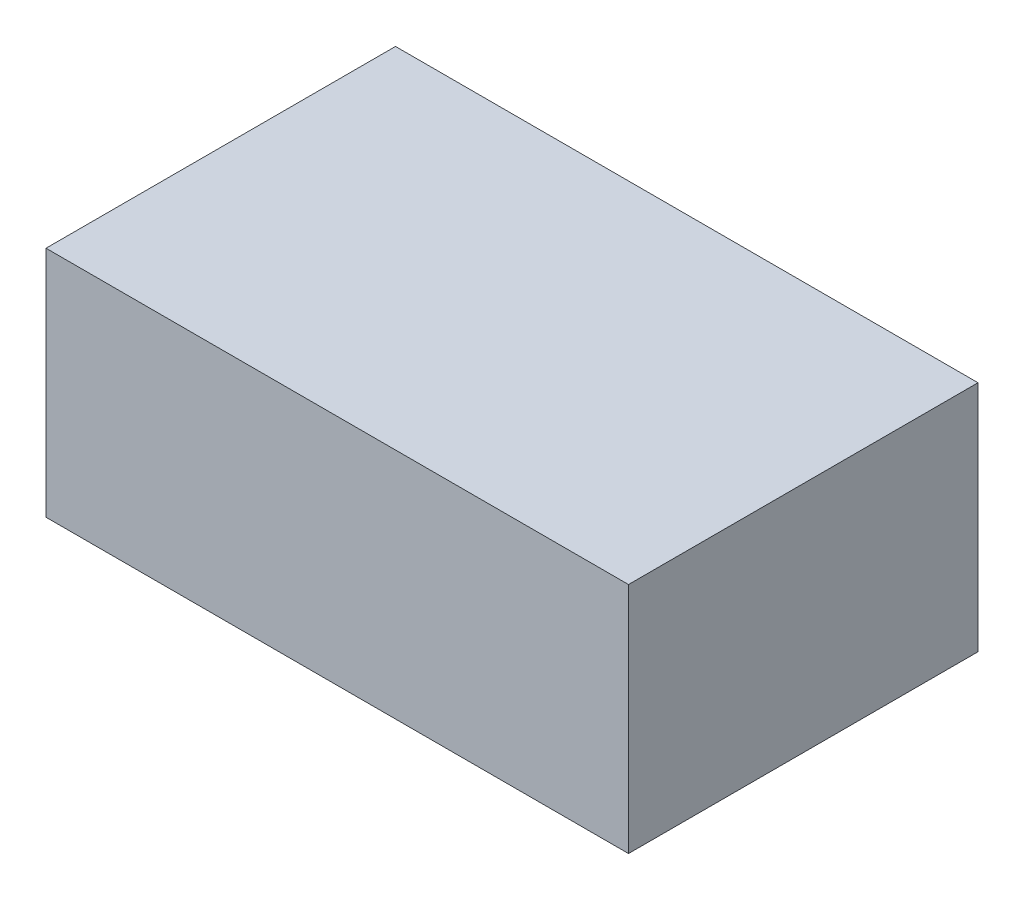
ISO-10303-21;
HEADER;
FILE_DESCRIPTION(('STEP AP214'),'2;1');
FILE_NAME('part.step','',(''),(''),'','','');
FILE_SCHEMA(('AUTOMOTIVE_DESIGN { 1 0 10303 214 1 1 1 1 }'));
ENDSEC;
DATA;
#1=APPLICATION_CONTEXT('core data for automotive mechanical design processes');
#2=APPLICATION_PROTOCOL_DEFINITION('international standard','automotive_design',2000,#1);
#3=PRODUCT_CONTEXT('',#1,'mechanical');
#4=PRODUCT('Part','Part','',(#3));
#5=PRODUCT_RELATED_PRODUCT_CATEGORY('part','',(#4));
#6=PRODUCT_DEFINITION_FORMATION('','',#4);
#7=PRODUCT_DEFINITION_CONTEXT('part definition',#1,'design');
#8=PRODUCT_DEFINITION('design','',#6,#7);
#9=PRODUCT_DEFINITION_SHAPE('','',#8);
#10=(LENGTH_UNIT() NAMED_UNIT(*) SI_UNIT(.MILLI.,.METRE.));
#11=(NAMED_UNIT(*) PLANE_ANGLE_UNIT() SI_UNIT($,.RADIAN.));
#12=(NAMED_UNIT(*) SI_UNIT($,.STERADIAN.) SOLID_ANGLE_UNIT());
#13=UNCERTAINTY_MEASURE_WITH_UNIT(LENGTH_MEASURE(1.E-05),#10,'distance_accuracy_value','');
#14=(GEOMETRIC_REPRESENTATION_CONTEXT(3) GLOBAL_UNCERTAINTY_ASSIGNED_CONTEXT((#13)) GLOBAL_UNIT_ASSIGNED_CONTEXT((#10,
#11,#12)) REPRESENTATION_CONTEXT('',''));
#15=CARTESIAN_POINT('',(0.,0.,0.));
#16=DIRECTION('',(0.,0.,1.));
#17=DIRECTION('',(1.,0.,0.));
#18=AXIS2_PLACEMENT_3D('',#15,#16,#17);
#19=CARTESIAN_POINT('',(62.5,50.,37.5));
#20=DIRECTION('',(-1.,0.,0.));
#21=DIRECTION('',(0.,0.,1.));
#22=AXIS2_PLACEMENT_3D('',#19,#20,#21);
#23=PLANE('',#22);
#24=DIRECTION('',(0.,0.,-1.));
#25=VECTOR('',#24,1.);
#26=CARTESIAN_POINT('',(62.5,0.,37.5));
#27=LINE('',#26,#25);
#28=CARTESIAN_POINT('',(62.5,0.,37.5));
#29=VERTEX_POINT('',#28);
#30=CARTESIAN_POINT('',(62.5,0.,-37.5));
#31=VERTEX_POINT('',#30);
#32=EDGE_CURVE('E102',#29,#31,#27,.T.);
#33=ORIENTED_EDGE('',*,*,#32,.T.);
#34=DIRECTION('',(0.,-1.,0.));
#35=VECTOR('',#34,1.);
#36=CARTESIAN_POINT('',(62.5,50.,-37.5));
#37=LINE('',#36,#35);
#38=CARTESIAN_POINT('',(62.5,50.,-37.5));
#39=VERTEX_POINT('',#38);
#40=EDGE_CURVE('E11',#39,#31,#37,.T.);
#41=ORIENTED_EDGE('',*,*,#40,.F.);
#42=DIRECTION('',(0.,0.,-1.));
#43=VECTOR('',#42,1.);
#44=CARTESIAN_POINT('',(62.5,50.,37.5));
#45=LINE('',#44,#43);
#46=CARTESIAN_POINT('',(62.5,50.,37.5));
#47=VERTEX_POINT('',#46);
#48=EDGE_CURVE('E90',#47,#39,#45,.T.);
#49=ORIENTED_EDGE('',*,*,#48,.F.);
#50=DIRECTION('',(0.,-1.,0.));
#51=VECTOR('',#50,1.);
#52=CARTESIAN_POINT('',(62.5,50.,37.5));
#53=LINE('',#52,#51);
#54=EDGE_CURVE('E98',#47,#29,#53,.T.);
#55=ORIENTED_EDGE('',*,*,#54,.T.);
#56=EDGE_LOOP('',(#33,#41,#49,#55));
#57=FACE_BOUND('',#56,.T.);
#58=ADVANCED_FACE('F39',(#57),#23,.F.);
#59=CARTESIAN_POINT('',(-62.5,50.,-37.5));
#60=DIRECTION('',(0.,0.,1.));
#61=DIRECTION('',(1.,0.,0.));
#62=AXIS2_PLACEMENT_3D('',#59,#60,#61);
#63=PLANE('',#62);
#64=DIRECTION('',(-1.,0.,0.));
#65=VECTOR('',#64,1.);
#66=CARTESIAN_POINT('',(-62.5,0.,-37.5));
#67=LINE('',#66,#65);
#68=CARTESIAN_POINT('',(-62.5,0.,-37.5));
#69=VERTEX_POINT('',#68);
#70=EDGE_CURVE('E94',#31,#69,#67,.T.);
#71=ORIENTED_EDGE('',*,*,#70,.T.);
#72=DIRECTION('',(0.,-1.,0.));
#73=VECTOR('',#72,1.);
#74=CARTESIAN_POINT('',(-62.5,50.,-37.5));
#75=LINE('',#74,#73);
#76=CARTESIAN_POINT('',(-62.5,50.,-37.5));
#77=VERTEX_POINT('',#76);
#78=EDGE_CURVE('E47',#77,#69,#75,.T.);
#79=ORIENTED_EDGE('',*,*,#78,.F.);
#80=DIRECTION('',(-1.,0.,0.));
#81=VECTOR('',#80,1.);
#82=CARTESIAN_POINT('',(-62.5,50.,-37.5));
#83=LINE('',#82,#81);
#84=EDGE_CURVE('E85',#39,#77,#83,.T.);
#85=ORIENTED_EDGE('',*,*,#84,.F.);
#86=ORIENTED_EDGE('',*,*,#40,.T.);
#87=EDGE_LOOP('',(#71,#79,#85,#86));
#88=FACE_BOUND('',#87,.T.);
#89=ADVANCED_FACE('F93',(#88),#63,.F.);
#90=CARTESIAN_POINT('',(-62.5,50.,37.5));
#91=DIRECTION('',(1.,0.,0.));
#92=DIRECTION('',(0.,0.,-1.));
#93=AXIS2_PLACEMENT_3D('',#90,#91,#92);
#94=PLANE('',#93);
#95=DIRECTION('',(0.,0.,1.));
#96=VECTOR('',#95,1.);
#97=CARTESIAN_POINT('',(-62.5,0.,37.5));
#98=LINE('',#97,#96);
#99=CARTESIAN_POINT('',(-62.5,0.,37.5));
#100=VERTEX_POINT('',#99);
#101=EDGE_CURVE('E72',#69,#100,#98,.T.);
#102=ORIENTED_EDGE('',*,*,#101,.T.);
#103=DIRECTION('',(0.,-1.,0.));
#104=VECTOR('',#103,1.);
#105=CARTESIAN_POINT('',(-62.5,50.,37.5));
#106=LINE('',#105,#104);
#107=CARTESIAN_POINT('',(-62.5,50.,37.5));
#108=VERTEX_POINT('',#107);
#109=EDGE_CURVE('E95',#108,#100,#106,.T.);
#110=ORIENTED_EDGE('',*,*,#109,.F.);
#111=DIRECTION('',(0.,0.,1.));
#112=VECTOR('',#111,1.);
#113=CARTESIAN_POINT('',(-62.5,50.,37.5));
#114=LINE('',#113,#112);
#115=EDGE_CURVE('E88',#77,#108,#114,.T.);
#116=ORIENTED_EDGE('',*,*,#115,.F.);
#117=ORIENTED_EDGE('',*,*,#78,.T.);
#118=EDGE_LOOP('',(#102,#110,#116,#117));
#119=FACE_BOUND('',#118,.T.);
#120=ADVANCED_FACE('F96',(#119),#94,.F.);
#121=CARTESIAN_POINT('',(-62.5,50.,37.5));
#122=DIRECTION('',(0.,0.,-1.));
#123=DIRECTION('',(-1.,0.,0.));
#124=AXIS2_PLACEMENT_3D('',#121,#122,#123);
#125=PLANE('',#124);
#126=DIRECTION('',(1.,0.,0.));
#127=VECTOR('',#126,1.);
#128=CARTESIAN_POINT('',(-62.5,0.,37.5));
#129=LINE('',#128,#127);
#130=EDGE_CURVE('E78',#100,#29,#129,.T.);
#131=ORIENTED_EDGE('',*,*,#130,.T.);
#132=ORIENTED_EDGE('',*,*,#54,.F.);
#133=DIRECTION('',(1.,0.,0.));
#134=VECTOR('',#133,1.);
#135=CARTESIAN_POINT('',(-62.5,50.,37.5));
#136=LINE('',#135,#134);
#137=EDGE_CURVE('E55',#108,#47,#136,.T.);
#138=ORIENTED_EDGE('',*,*,#137,.F.);
#139=ORIENTED_EDGE('',*,*,#109,.T.);
#140=EDGE_LOOP('',(#131,#132,#138,#139));
#141=FACE_BOUND('',#140,.T.);
#142=ADVANCED_FACE('F110',(#141),#125,.F.);
#143=CARTESIAN_POINT('',(0.,50.,0.));
#144=DIRECTION('',(0.,-1.,0.));
#145=DIRECTION('',(0.,0.,-1.));
#146=AXIS2_PLACEMENT_3D('',#143,#144,#145);
#147=PLANE('',#146);
#148=ORIENTED_EDGE('',*,*,#48,.T.);
#149=ORIENTED_EDGE('',*,*,#84,.T.);
#150=ORIENTED_EDGE('',*,*,#115,.T.);
#151=ORIENTED_EDGE('',*,*,#137,.T.);
#152=EDGE_LOOP('',(#148,#149,#150,#151));
#153=FACE_BOUND('',#152,.T.);
#154=ADVANCED_FACE('F86',(#153),#147,.F.);
#155=CARTESIAN_POINT('',(0.,0.,0.));
#156=DIRECTION('',(0.,-1.,0.));
#157=DIRECTION('',(0.,0.,-1.));
#158=AXIS2_PLACEMENT_3D('',#155,#156,#157);
#159=PLANE('',#158);
#160=CARTESIAN_POINT('',(-50.,0.,0.));
#161=DIRECTION('',(0.,1.,0.));
#162=DIRECTION('',(0.,0.,1.));
#163=AXIS2_PLACEMENT_3D('',#160,#161,#162);
#164=CIRCLE('',#163,4.);
#165=CARTESIAN_POINT('',(-50.,0.,4.));
#166=VERTEX_POINT('',#165);
#167=EDGE_CURVE('E122',#166,#166,#164,.T.);
#168=ORIENTED_EDGE('',*,*,#167,.T.);
#169=EDGE_LOOP('',(#168));
#170=FACE_BOUND('',#169,.T.);
#171=CARTESIAN_POINT('',(50.,0.,0.));
#172=DIRECTION('',(0.,1.,0.));
#173=DIRECTION('',(0.,0.,1.));
#174=AXIS2_PLACEMENT_3D('',#171,#172,#173);
#175=CIRCLE('',#174,4.);
#176=CARTESIAN_POINT('',(50.,0.,4.));
#177=VERTEX_POINT('',#176);
#178=EDGE_CURVE('E119',#177,#177,#175,.T.);
#179=ORIENTED_EDGE('',*,*,#178,.T.);
#180=EDGE_LOOP('',(#179));
#181=FACE_BOUND('',#180,.T.);
#182=ORIENTED_EDGE('',*,*,#32,.F.);
#183=ORIENTED_EDGE('',*,*,#130,.F.);
#184=ORIENTED_EDGE('',*,*,#101,.F.);
#185=ORIENTED_EDGE('',*,*,#70,.F.);
#186=EDGE_LOOP('',(#182,#183,#184,#185));
#187=FACE_BOUND('',#186,.T.);
#188=ADVANCED_FACE('F113',(#170,#181,#187),#159,.T.);
#189=CARTESIAN_POINT('',(50.,14.,0.));
#190=DIRECTION('',(0.,-1.,0.));
#191=DIRECTION('',(0.,0.,-1.));
#192=AXIS2_PLACEMENT_3D('',#189,#190,#191);
#193=CYLINDRICAL_SURFACE('',#192,4.);
#194=CARTESIAN_POINT('',(50.,14.,0.));
#195=DIRECTION('',(0.,1.,0.));
#196=DIRECTION('',(0.,0.,1.));
#197=AXIS2_PLACEMENT_3D('',#194,#195,#196);
#198=CIRCLE('',#197,4.);
#199=CARTESIAN_POINT('',(50.,14.,4.));
#200=VERTEX_POINT('',#199);
#201=EDGE_CURVE('E116',#200,#200,#198,.T.);
#202=ORIENTED_EDGE('',*,*,#201,.T.);
#203=EDGE_LOOP('',(#202));
#204=FACE_BOUND('',#203,.T.);
#205=ORIENTED_EDGE('',*,*,#178,.F.);
#206=EDGE_LOOP('',(#205));
#207=FACE_BOUND('',#206,.T.);
#208=ADVANCED_FACE('F152',(#204,#207),#193,.F.);
#209=CARTESIAN_POINT('',(50.,14.,0.));
#210=DIRECTION('',(0.,1.,0.));
#211=DIRECTION('',(0.,0.,1.));
#212=AXIS2_PLACEMENT_3D('',#209,#210,#211);
#213=PLANE('',#212);
#214=ORIENTED_EDGE('',*,*,#201,.F.);
#215=EDGE_LOOP('',(#214));
#216=FACE_BOUND('',#215,.T.);
#217=ADVANCED_FACE('F137',(#216),#213,.F.);
#218=CARTESIAN_POINT('',(-50.,14.,0.));
#219=DIRECTION('',(0.,-1.,0.));
#220=DIRECTION('',(0.,0.,-1.));
#221=AXIS2_PLACEMENT_3D('',#218,#219,#220);
#222=CYLINDRICAL_SURFACE('',#221,4.);
#223=CARTESIAN_POINT('',(-50.,14.,0.));
#224=DIRECTION('',(0.,1.,0.));
#225=DIRECTION('',(0.,0.,1.));
#226=AXIS2_PLACEMENT_3D('',#223,#224,#225);
#227=CIRCLE('',#226,4.);
#228=CARTESIAN_POINT('',(-50.,14.,4.));
#229=VERTEX_POINT('',#228);
#230=EDGE_CURVE('E105',#229,#229,#227,.T.);
#231=ORIENTED_EDGE('',*,*,#230,.T.);
#232=EDGE_LOOP('',(#231));
#233=FACE_BOUND('',#232,.T.);
#234=ORIENTED_EDGE('',*,*,#167,.F.);
#235=EDGE_LOOP('',(#234));
#236=FACE_BOUND('',#235,.T.);
#237=ADVANCED_FACE('F128',(#233,#236),#222,.F.);
#238=CARTESIAN_POINT('',(-50.,14.,0.));
#239=DIRECTION('',(0.,1.,0.));
#240=DIRECTION('',(0.,0.,1.));
#241=AXIS2_PLACEMENT_3D('',#238,#239,#240);
#242=PLANE('',#241);
#243=ORIENTED_EDGE('',*,*,#230,.F.);
#244=EDGE_LOOP('',(#243));
#245=FACE_BOUND('',#244,.T.);
#246=ADVANCED_FACE('F131',(#245),#242,.F.);
#247=CLOSED_SHELL('',(#58,#89,#120,#142,#154,#188,#208,#217,#237,#246));
#248=MANIFOLD_SOLID_BREP('B2',#247);
#249=ADVANCED_BREP_SHAPE_REPRESENTATION('',(#18,#248),#14);
#250=SHAPE_DEFINITION_REPRESENTATION(#9,#249);
ENDSEC;
END-ISO-10303-21;
